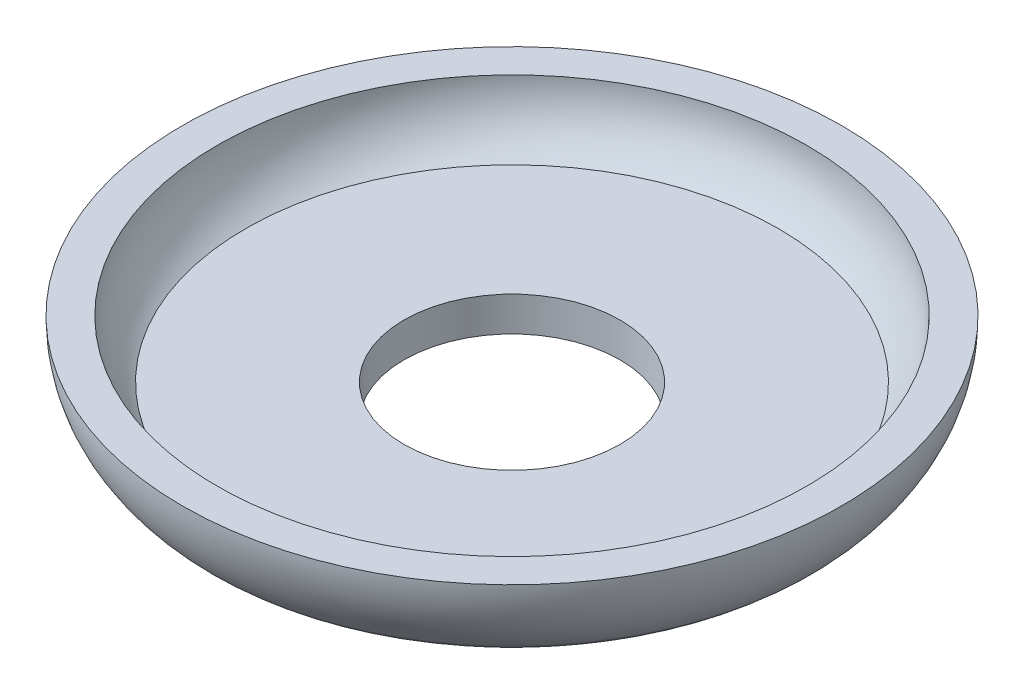
ISO-10303-21;
HEADER;
FILE_DESCRIPTION(('STEP AP214'),'2;1');
FILE_NAME('part.step','',(''),(''),'','','');
FILE_SCHEMA(('AUTOMOTIVE_DESIGN { 1 0 10303 214 1 1 1 1 }'));
ENDSEC;
DATA;
#1=APPLICATION_CONTEXT('core data for automotive mechanical design processes');
#2=APPLICATION_PROTOCOL_DEFINITION('international standard','automotive_design',2000,#1);
#3=PRODUCT_CONTEXT('',#1,'mechanical');
#4=PRODUCT('Part','Part','',(#3));
#5=PRODUCT_RELATED_PRODUCT_CATEGORY('part','',(#4));
#6=PRODUCT_DEFINITION_FORMATION('','',#4);
#7=PRODUCT_DEFINITION_CONTEXT('part definition',#1,'design');
#8=PRODUCT_DEFINITION('design','',#6,#7);
#9=PRODUCT_DEFINITION_SHAPE('','',#8);
#10=(LENGTH_UNIT() NAMED_UNIT(*) SI_UNIT(.MILLI.,.METRE.));
#11=(NAMED_UNIT(*) PLANE_ANGLE_UNIT() SI_UNIT($,.RADIAN.));
#12=(NAMED_UNIT(*) SI_UNIT($,.STERADIAN.) SOLID_ANGLE_UNIT());
#13=UNCERTAINTY_MEASURE_WITH_UNIT(LENGTH_MEASURE(1.E-05),#10,'distance_accuracy_value','');
#14=(GEOMETRIC_REPRESENTATION_CONTEXT(3) GLOBAL_UNCERTAINTY_ASSIGNED_CONTEXT((#13)) GLOBAL_UNIT_ASSIGNED_CONTEXT((#10,
#11,#12)) REPRESENTATION_CONTEXT('',''));
#15=CARTESIAN_POINT('',(0.,0.,0.));
#16=DIRECTION('',(0.,0.,1.));
#17=DIRECTION('',(1.,0.,0.));
#18=AXIS2_PLACEMENT_3D('',#15,#16,#17);
#19=CARTESIAN_POINT('',(0.,0.,0.));
#20=DIRECTION('',(0.,-1.,0.));
#21=DIRECTION('',(0.,0.,-1.));
#22=AXIS2_PLACEMENT_3D('',#19,#20,#21);
#23=CYLINDRICAL_SURFACE('',#22,4.7625);
#24=CARTESIAN_POINT('',(0.,0.,0.));
#25=DIRECTION('',(0.,-1.,0.));
#26=DIRECTION('',(0.,0.,-1.));
#27=AXIS2_PLACEMENT_3D('',#24,#25,#26);
#28=CIRCLE('',#27,4.7625);
#29=CARTESIAN_POINT('',(0.,0.,-4.7625));
#30=VERTEX_POINT('',#29);
#31=EDGE_CURVE('E10',#30,#30,#28,.T.);
#32=ORIENTED_EDGE('',*,*,#31,.T.);
#33=EDGE_LOOP('',(#32));
#34=FACE_BOUND('',#33,.T.);
#35=CARTESIAN_POINT('',(0.,1.524,0.));
#36=DIRECTION('',(0.,-1.,0.));
#37=DIRECTION('',(0.,0.,-1.));
#38=AXIS2_PLACEMENT_3D('',#35,#36,#37);
#39=CIRCLE('',#38,4.7625);
#40=CARTESIAN_POINT('',(0.,1.524,-4.7625));
#41=VERTEX_POINT('',#40);
#42=EDGE_CURVE('E57',#41,#41,#39,.T.);
#43=ORIENTED_EDGE('',*,*,#42,.F.);
#44=EDGE_LOOP('',(#43));
#45=FACE_BOUND('',#44,.T.);
#46=ADVANCED_FACE('F32',(#34,#45),#23,.F.);
#47=CARTESIAN_POINT('',(4.7625,0.,0.));
#48=DIRECTION('',(0.,-1.,0.));
#49=DIRECTION('',(0.,0.,-1.));
#50=AXIS2_PLACEMENT_3D('',#47,#48,#49);
#51=PLANE('',#50);
#52=CARTESIAN_POINT('',(0.,0.,0.));
#53=DIRECTION('',(0.,-1.,0.));
#54=DIRECTION('',(0.,0.,-1.));
#55=AXIS2_PLACEMENT_3D('',#52,#53,#54);
#56=CIRCLE('',#55,11.3717825115066);
#57=CARTESIAN_POINT('',(0.,0.,-11.3717825115066));
#58=VERTEX_POINT('',#57);
#59=EDGE_CURVE('E38',#58,#58,#56,.T.);
#60=ORIENTED_EDGE('',*,*,#59,.T.);
#61=EDGE_LOOP('',(#60));
#62=FACE_BOUND('',#61,.T.);
#63=ORIENTED_EDGE('',*,*,#31,.F.);
#64=EDGE_LOOP('',(#63));
#65=FACE_BOUND('',#64,.T.);
#66=ADVANCED_FACE('F65',(#62,#65),#51,.T.);
#67=CARTESIAN_POINT('',(0.,2.54,0.));
#68=DIRECTION('',(0.,-1.,0.));
#69=DIRECTION('',(0.,0.,-1.));
#70=AXIS2_PLACEMENT_3D('',#67,#68,#69);
#71=TOROIDAL_SURFACE('',#70,11.3717825115066,2.54);
#72=CARTESIAN_POINT('',(0.,0.747058823529414,0.));
#73=DIRECTION('',(0.,-1.,0.));
#74=DIRECTION('',(0.,0.,-1.));
#75=AXIS2_PLACEMENT_3D('',#72,#73,#74);
#76=CIRCLE('',#75,13.1709384073968);
#77=CARTESIAN_POINT('',(0.,0.747058823529414,-13.1709384073968));
#78=VERTEX_POINT('',#77);
#79=EDGE_CURVE('E42',#78,#78,#76,.T.);
#80=ORIENTED_EDGE('',*,*,#79,.T.);
#81=EDGE_LOOP('',(#80));
#82=FACE_BOUND('',#81,.T.);
#83=ORIENTED_EDGE('',*,*,#59,.F.);
#84=EDGE_LOOP('',(#83));
#85=FACE_BOUND('',#84,.T.);
#86=ADVANCED_FACE('F69',(#82,#85),#71,.T.);
#87=CARTESIAN_POINT('',(0.,4.064,0.));
#88=DIRECTION('',(0.,-1.,0.));
#89=DIRECTION('',(0.,0.,-1.));
#90=AXIS2_PLACEMENT_3D('',#87,#88,#89);
#91=TOROIDAL_SURFACE('',#90,9.8425,4.699);
#92=CARTESIAN_POINT('',(0.,4.064,0.));
#93=DIRECTION('',(0.,-1.,0.));
#94=DIRECTION('',(0.,0.,-1.));
#95=AXIS2_PLACEMENT_3D('',#92,#93,#94);
#96=CIRCLE('',#95,14.5415);
#97=CARTESIAN_POINT('',(0.,4.064,-14.5415));
#98=VERTEX_POINT('',#97);
#99=EDGE_CURVE('E46',#98,#98,#96,.T.);
#100=ORIENTED_EDGE('',*,*,#99,.T.);
#101=EDGE_LOOP('',(#100));
#102=FACE_BOUND('',#101,.T.);
#103=ORIENTED_EDGE('',*,*,#79,.F.);
#104=EDGE_LOOP('',(#103));
#105=FACE_BOUND('',#104,.T.);
#106=ADVANCED_FACE('F73',(#102,#105),#91,.T.);
#107=CARTESIAN_POINT('',(13.0175,4.064,0.));
#108=DIRECTION('',(0.,1.,0.));
#109=DIRECTION('',(0.,0.,1.));
#110=AXIS2_PLACEMENT_3D('',#107,#108,#109);
#111=PLANE('',#110);
#112=CARTESIAN_POINT('',(0.,4.064,0.));
#113=DIRECTION('',(0.,-1.,0.));
#114=DIRECTION('',(0.,0.,-1.));
#115=AXIS2_PLACEMENT_3D('',#112,#113,#114);
#116=CIRCLE('',#115,13.0175);
#117=CARTESIAN_POINT('',(0.,4.064,-13.0175));
#118=VERTEX_POINT('',#117);
#119=EDGE_CURVE('E51',#118,#118,#116,.T.);
#120=ORIENTED_EDGE('',*,*,#119,.T.);
#121=EDGE_LOOP('',(#120));
#122=FACE_BOUND('',#121,.T.);
#123=ORIENTED_EDGE('',*,*,#99,.F.);
#124=EDGE_LOOP('',(#123));
#125=FACE_BOUND('',#124,.T.);
#126=ADVANCED_FACE('F80',(#122,#125),#111,.T.);
#127=CARTESIAN_POINT('',(0.,4.064,0.));
#128=DIRECTION('',(0.,-1.,0.));
#129=DIRECTION('',(0.,0.,-1.));
#130=AXIS2_PLACEMENT_3D('',#127,#128,#129);
#131=TOROIDAL_SURFACE('',#130,9.8425,3.175);
#132=CARTESIAN_POINT('',(0.,1.524,0.));
#133=DIRECTION('',(0.,-1.,0.));
#134=DIRECTION('',(0.,0.,-1.));
#135=AXIS2_PLACEMENT_3D('',#132,#133,#134);
#136=CIRCLE('',#135,11.7475);
#137=CARTESIAN_POINT('',(0.,1.524,-11.7475));
#138=VERTEX_POINT('',#137);
#139=EDGE_CURVE('E54',#138,#138,#136,.T.);
#140=ORIENTED_EDGE('',*,*,#139,.T.);
#141=EDGE_LOOP('',(#140));
#142=FACE_BOUND('',#141,.T.);
#143=ORIENTED_EDGE('',*,*,#119,.F.);
#144=EDGE_LOOP('',(#143));
#145=FACE_BOUND('',#144,.T.);
#146=ADVANCED_FACE('F84',(#142,#145),#131,.F.);
#147=CARTESIAN_POINT('',(4.7625,1.524,0.));
#148=DIRECTION('',(0.,1.,0.));
#149=DIRECTION('',(0.,0.,1.));
#150=AXIS2_PLACEMENT_3D('',#147,#148,#149);
#151=PLANE('',#150);
#152=ORIENTED_EDGE('',*,*,#42,.T.);
#153=EDGE_LOOP('',(#152));
#154=FACE_BOUND('',#153,.T.);
#155=ORIENTED_EDGE('',*,*,#139,.F.);
#156=EDGE_LOOP('',(#155));
#157=FACE_BOUND('',#156,.T.);
#158=ADVANCED_FACE('F61',(#154,#157),#151,.T.);
#159=CLOSED_SHELL('',(#46,#66,#86,#106,#126,#146,#158));
#160=MANIFOLD_SOLID_BREP('B2',#159);
#161=ADVANCED_BREP_SHAPE_REPRESENTATION('',(#18,#160),#14);
#162=SHAPE_DEFINITION_REPRESENTATION(#9,#161);
ENDSEC;
END-ISO-10303-21;
